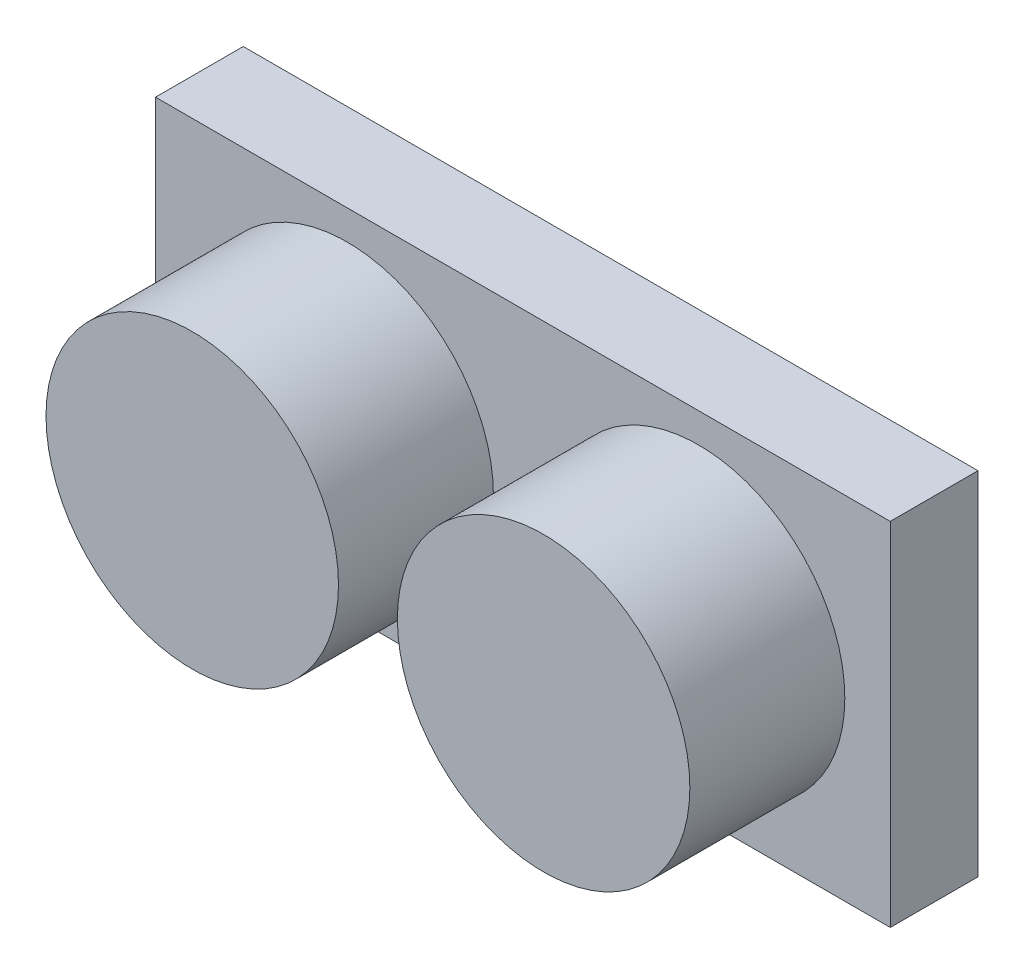
ISO-10303-21;
HEADER;
FILE_DESCRIPTION(('STEP AP214'),'2;1');
FILE_NAME('part.step','',(''),(''),'','','');
FILE_SCHEMA(('AUTOMOTIVE_DESIGN { 1 0 10303 214 1 1 1 1 }'));
ENDSEC;
DATA;
#1=APPLICATION_CONTEXT('core data for automotive mechanical design processes');
#2=APPLICATION_PROTOCOL_DEFINITION('international standard','automotive_design',2000,#1);
#3=PRODUCT_CONTEXT('',#1,'mechanical');
#4=PRODUCT('Part','Part','',(#3));
#5=PRODUCT_RELATED_PRODUCT_CATEGORY('part','',(#4));
#6=PRODUCT_DEFINITION_FORMATION('','',#4);
#7=PRODUCT_DEFINITION_CONTEXT('part definition',#1,'design');
#8=PRODUCT_DEFINITION('design','',#6,#7);
#9=PRODUCT_DEFINITION_SHAPE('','',#8);
#10=(LENGTH_UNIT() NAMED_UNIT(*) SI_UNIT(.MILLI.,.METRE.));
#11=(NAMED_UNIT(*) PLANE_ANGLE_UNIT() SI_UNIT($,.RADIAN.));
#12=(NAMED_UNIT(*) SI_UNIT($,.STERADIAN.) SOLID_ANGLE_UNIT());
#13=UNCERTAINTY_MEASURE_WITH_UNIT(LENGTH_MEASURE(1.E-05),#10,'distance_accuracy_value','');
#14=(GEOMETRIC_REPRESENTATION_CONTEXT(3) GLOBAL_UNCERTAINTY_ASSIGNED_CONTEXT((#13)) GLOBAL_UNIT_ASSIGNED_CONTEXT((#10,
#11,#12)) REPRESENTATION_CONTEXT('',''));
#15=CARTESIAN_POINT('',(0.,0.,0.));
#16=DIRECTION('',(0.,0.,1.));
#17=DIRECTION('',(1.,0.,0.));
#18=AXIS2_PLACEMENT_3D('',#15,#16,#17);
#19=CARTESIAN_POINT('',(-12.56011836265,-6.01282262041757,3.));
#20=DIRECTION('',(1.,0.,0.));
#21=DIRECTION('',(0.,0.,-1.));
#22=AXIS2_PLACEMENT_3D('',#19,#20,#21);
#23=PLANE('',#22);
#24=DIRECTION('',(0.,-1.,0.));
#25=VECTOR('',#24,1.);
#26=CARTESIAN_POINT('',(-12.56011836265,-6.01282262041757,0.));
#27=LINE('',#26,#25);
#28=CARTESIAN_POINT('',(-12.56011836265,6.01282262041757,0.));
#29=VERTEX_POINT('',#28);
#30=CARTESIAN_POINT('',(-12.56011836265,-6.01282262041757,0.));
#31=VERTEX_POINT('',#30);
#32=EDGE_CURVE('E99',#29,#31,#27,.T.);
#33=ORIENTED_EDGE('',*,*,#32,.T.);
#34=DIRECTION('',(0.,0.,-1.));
#35=VECTOR('',#34,1.);
#36=CARTESIAN_POINT('',(-12.56011836265,-6.01282262041757,3.));
#37=LINE('',#36,#35);
#38=CARTESIAN_POINT('',(-12.56011836265,-6.01282262041757,3.));
#39=VERTEX_POINT('',#38);
#40=EDGE_CURVE('E36',#39,#31,#37,.T.);
#41=ORIENTED_EDGE('',*,*,#40,.F.);
#42=DIRECTION('',(0.,-1.,0.));
#43=VECTOR('',#42,1.);
#44=CARTESIAN_POINT('',(-12.56011836265,-6.01282262041757,3.));
#45=LINE('',#44,#43);
#46=CARTESIAN_POINT('',(-12.56011836265,6.01282262041757,3.));
#47=VERTEX_POINT('',#46);
#48=EDGE_CURVE('E86',#47,#39,#45,.T.);
#49=ORIENTED_EDGE('',*,*,#48,.F.);
#50=DIRECTION('',(0.,0.,-1.));
#51=VECTOR('',#50,1.);
#52=CARTESIAN_POINT('',(-12.56011836265,6.01282262041757,3.));
#53=LINE('',#52,#51);
#54=EDGE_CURVE('E95',#47,#29,#53,.T.);
#55=ORIENTED_EDGE('',*,*,#54,.T.);
#56=EDGE_LOOP('',(#33,#41,#49,#55));
#57=FACE_BOUND('',#56,.T.);
#58=ADVANCED_FACE('F33',(#57),#23,.F.);
#59=CARTESIAN_POINT('',(12.56011836265,-6.01282262041757,3.));
#60=DIRECTION('',(0.,1.,0.));
#61=DIRECTION('',(0.,0.,1.));
#62=AXIS2_PLACEMENT_3D('',#59,#60,#61);
#63=PLANE('',#62);
#64=DIRECTION('',(1.,0.,0.));
#65=VECTOR('',#64,1.);
#66=CARTESIAN_POINT('',(12.56011836265,-6.01282262041757,0.));
#67=LINE('',#66,#65);
#68=CARTESIAN_POINT('',(12.56011836265,-6.01282262041757,0.));
#69=VERTEX_POINT('',#68);
#70=EDGE_CURVE('E91',#31,#69,#67,.T.);
#71=ORIENTED_EDGE('',*,*,#70,.T.);
#72=DIRECTION('',(0.,0.,-1.));
#73=VECTOR('',#72,1.);
#74=CARTESIAN_POINT('',(12.56011836265,-6.01282262041757,3.));
#75=LINE('',#74,#73);
#76=CARTESIAN_POINT('',(12.56011836265,-6.01282262041757,3.));
#77=VERTEX_POINT('',#76);
#78=EDGE_CURVE('E89',#77,#69,#75,.T.);
#79=ORIENTED_EDGE('',*,*,#78,.F.);
#80=DIRECTION('',(1.,0.,0.));
#81=VECTOR('',#80,1.);
#82=CARTESIAN_POINT('',(12.56011836265,-6.01282262041757,3.));
#83=LINE('',#82,#81);
#84=EDGE_CURVE('E81',#39,#77,#83,.T.);
#85=ORIENTED_EDGE('',*,*,#84,.F.);
#86=ORIENTED_EDGE('',*,*,#40,.T.);
#87=EDGE_LOOP('',(#71,#79,#85,#86));
#88=FACE_BOUND('',#87,.T.);
#89=ADVANCED_FACE('F90',(#88),#63,.F.);
#90=CARTESIAN_POINT('',(12.56011836265,-6.01282262041757,3.));
#91=DIRECTION('',(-1.,0.,0.));
#92=DIRECTION('',(0.,0.,1.));
#93=AXIS2_PLACEMENT_3D('',#90,#91,#92);
#94=PLANE('',#93);
#95=DIRECTION('',(0.,1.,0.));
#96=VECTOR('',#95,1.);
#97=CARTESIAN_POINT('',(12.56011836265,-6.01282262041757,0.));
#98=LINE('',#97,#96);
#99=CARTESIAN_POINT('',(12.56011836265,6.01282262041757,0.));
#100=VERTEX_POINT('',#99);
#101=EDGE_CURVE('E67',#69,#100,#98,.T.);
#102=ORIENTED_EDGE('',*,*,#101,.T.);
#103=DIRECTION('',(0.,0.,-1.));
#104=VECTOR('',#103,1.);
#105=CARTESIAN_POINT('',(12.56011836265,6.01282262041757,3.));
#106=LINE('',#105,#104);
#107=CARTESIAN_POINT('',(12.56011836265,6.01282262041757,3.));
#108=VERTEX_POINT('',#107);
#109=EDGE_CURVE('E92',#108,#100,#106,.T.);
#110=ORIENTED_EDGE('',*,*,#109,.F.);
#111=DIRECTION('',(0.,1.,0.));
#112=VECTOR('',#111,1.);
#113=CARTESIAN_POINT('',(12.56011836265,-6.01282262041757,3.));
#114=LINE('',#113,#112);
#115=EDGE_CURVE('E84',#77,#108,#114,.T.);
#116=ORIENTED_EDGE('',*,*,#115,.F.);
#117=ORIENTED_EDGE('',*,*,#78,.T.);
#118=EDGE_LOOP('',(#102,#110,#116,#117));
#119=FACE_BOUND('',#118,.T.);
#120=ADVANCED_FACE('F93',(#119),#94,.F.);
#121=CARTESIAN_POINT('',(12.56011836265,6.01282262041757,3.));
#122=DIRECTION('',(0.,-1.,0.));
#123=DIRECTION('',(0.,0.,-1.));
#124=AXIS2_PLACEMENT_3D('',#121,#122,#123);
#125=PLANE('',#124);
#126=DIRECTION('',(-1.,0.,0.));
#127=VECTOR('',#126,1.);
#128=CARTESIAN_POINT('',(12.56011836265,6.01282262041757,0.));
#129=LINE('',#128,#127);
#130=EDGE_CURVE('E73',#100,#29,#129,.T.);
#131=ORIENTED_EDGE('',*,*,#130,.T.);
#132=ORIENTED_EDGE('',*,*,#54,.F.);
#133=DIRECTION('',(-1.,0.,0.));
#134=VECTOR('',#133,1.);
#135=CARTESIAN_POINT('',(12.56011836265,6.01282262041757,3.));
#136=LINE('',#135,#134);
#137=EDGE_CURVE('E50',#108,#47,#136,.T.);
#138=ORIENTED_EDGE('',*,*,#137,.F.);
#139=ORIENTED_EDGE('',*,*,#109,.T.);
#140=EDGE_LOOP('',(#131,#132,#138,#139));
#141=FACE_BOUND('',#140,.T.);
#142=ADVANCED_FACE('F107',(#141),#125,.F.);
#143=CARTESIAN_POINT('',(0.,0.,3.));
#144=DIRECTION('',(0.,0.,1.));
#145=DIRECTION('',(1.,0.,0.));
#146=AXIS2_PLACEMENT_3D('',#143,#144,#145);
#147=PLANE('',#146);
#148=CARTESIAN_POINT('',(-6.00666219725316,0.,3.));
#149=DIRECTION('',(0.,0.,1.));
#150=DIRECTION('',(-1.,0.,0.));
#151=AXIS2_PLACEMENT_3D('',#148,#149,#150);
#152=CIRCLE('',#151,5.);
#153=CARTESIAN_POINT('',(-11.0066621972532,0.,3.));
#154=VERTEX_POINT('',#153);
#155=EDGE_CURVE('E116',#154,#154,#152,.T.);
#156=ORIENTED_EDGE('',*,*,#155,.F.);
#157=EDGE_LOOP('',(#156));
#158=FACE_BOUND('',#157,.T.);
#159=CARTESIAN_POINT('',(6.00666219725316,0.,3.));
#160=DIRECTION('',(0.,0.,1.));
#161=DIRECTION('',(1.,0.,0.));
#162=AXIS2_PLACEMENT_3D('',#159,#160,#161);
#163=CIRCLE('',#162,5.);
#164=CARTESIAN_POINT('',(11.0066621972532,0.,3.));
#165=VERTEX_POINT('',#164);
#166=EDGE_CURVE('E11',#165,#165,#163,.T.);
#167=ORIENTED_EDGE('',*,*,#166,.F.);
#168=EDGE_LOOP('',(#167));
#169=FACE_BOUND('',#168,.T.);
#170=ORIENTED_EDGE('',*,*,#48,.T.);
#171=ORIENTED_EDGE('',*,*,#84,.T.);
#172=ORIENTED_EDGE('',*,*,#115,.T.);
#173=ORIENTED_EDGE('',*,*,#137,.T.);
#174=EDGE_LOOP('',(#170,#171,#172,#173));
#175=FACE_BOUND('',#174,.T.);
#176=ADVANCED_FACE('F82',(#158,#169,#175),#147,.T.);
#177=CARTESIAN_POINT('',(0.,0.,0.));
#178=DIRECTION('',(0.,0.,1.));
#179=DIRECTION('',(1.,0.,0.));
#180=AXIS2_PLACEMENT_3D('',#177,#178,#179);
#181=PLANE('',#180);
#182=ORIENTED_EDGE('',*,*,#32,.F.);
#183=ORIENTED_EDGE('',*,*,#130,.F.);
#184=ORIENTED_EDGE('',*,*,#101,.F.);
#185=ORIENTED_EDGE('',*,*,#70,.F.);
#186=EDGE_LOOP('',(#182,#183,#184,#185));
#187=FACE_BOUND('',#186,.T.);
#188=ADVANCED_FACE('F110',(#187),#181,.F.);
#189=CARTESIAN_POINT('',(6.00666219725316,0.,8.29790091184576));
#190=DIRECTION('',(0.,0.,-1.));
#191=DIRECTION('',(-1.,0.,0.));
#192=AXIS2_PLACEMENT_3D('',#189,#190,#191);
#193=CYLINDRICAL_SURFACE('',#192,5.);
#194=CARTESIAN_POINT('',(6.00666219725316,0.,8.29790091184576));
#195=DIRECTION('',(0.,0.,1.));
#196=DIRECTION('',(1.,0.,0.));
#197=AXIS2_PLACEMENT_3D('',#194,#195,#196);
#198=CIRCLE('',#197,5.);
#199=CARTESIAN_POINT('',(11.0066621972532,0.,8.29790091184576));
#200=VERTEX_POINT('',#199);
#201=EDGE_CURVE('E102',#200,#200,#198,.T.);
#202=ORIENTED_EDGE('',*,*,#201,.F.);
#203=EDGE_LOOP('',(#202));
#204=FACE_BOUND('',#203,.T.);
#205=ORIENTED_EDGE('',*,*,#166,.T.);
#206=EDGE_LOOP('',(#205));
#207=FACE_BOUND('',#206,.T.);
#208=ADVANCED_FACE('F136',(#204,#207),#193,.T.);
#209=CARTESIAN_POINT('',(6.00666219725316,0.,8.29790091184576));
#210=DIRECTION('',(0.,0.,1.));
#211=DIRECTION('',(1.,0.,0.));
#212=AXIS2_PLACEMENT_3D('',#209,#210,#211);
#213=PLANE('',#212);
#214=ORIENTED_EDGE('',*,*,#201,.T.);
#215=EDGE_LOOP('',(#214));
#216=FACE_BOUND('',#215,.T.);
#217=ADVANCED_FACE('F127',(#216),#213,.T.);
#218=CARTESIAN_POINT('',(-6.00666219725316,0.,8.29790091184576));
#219=DIRECTION('',(0.,0.,-1.));
#220=DIRECTION('',(-1.,0.,0.));
#221=AXIS2_PLACEMENT_3D('',#218,#219,#220);
#222=CYLINDRICAL_SURFACE('',#221,5.);
#223=CARTESIAN_POINT('',(-6.00666219725316,0.,8.29790091184576));
#224=DIRECTION('',(0.,0.,1.));
#225=DIRECTION('',(-1.,0.,0.));
#226=AXIS2_PLACEMENT_3D('',#223,#224,#225);
#227=CIRCLE('',#226,5.);
#228=CARTESIAN_POINT('',(-11.0066621972532,0.,8.29790091184576));
#229=VERTEX_POINT('',#228);
#230=EDGE_CURVE('E115',#229,#229,#227,.T.);
#231=ORIENTED_EDGE('',*,*,#230,.F.);
#232=EDGE_LOOP('',(#231));
#233=FACE_BOUND('',#232,.T.);
#234=ORIENTED_EDGE('',*,*,#155,.T.);
#235=EDGE_LOOP('',(#234));
#236=FACE_BOUND('',#235,.T.);
#237=ADVANCED_FACE('F124',(#233,#236),#222,.T.);
#238=CARTESIAN_POINT('',(-6.00666219725316,0.,8.29790091184576));
#239=DIRECTION('',(0.,0.,-1.));
#240=DIRECTION('',(-1.,0.,0.));
#241=AXIS2_PLACEMENT_3D('',#238,#239,#240);
#242=PLANE('',#241);
#243=ORIENTED_EDGE('',*,*,#230,.T.);
#244=EDGE_LOOP('',(#243));
#245=FACE_BOUND('',#244,.T.);
#246=ADVANCED_FACE('F122',(#245),#242,.F.);
#247=CLOSED_SHELL('',(#58,#89,#120,#142,#176,#188,#208,#217,#237,#246));
#248=MANIFOLD_SOLID_BREP('B2',#247);
#249=ADVANCED_BREP_SHAPE_REPRESENTATION('',(#18,#248),#14);
#250=SHAPE_DEFINITION_REPRESENTATION(#9,#249);
ENDSEC;
END-ISO-10303-21;
